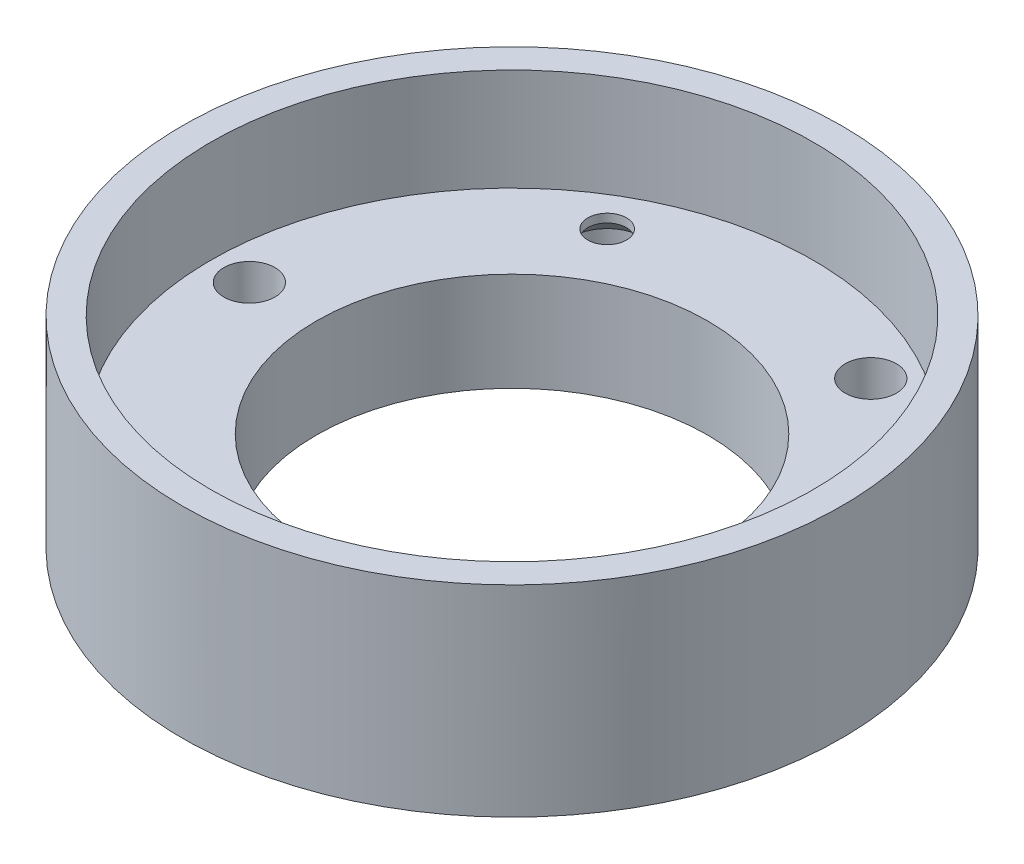
ISO-10303-21;
HEADER;
FILE_DESCRIPTION(('STEP AP214'),'2;1');
FILE_NAME('part.step','',(''),(''),'','','');
FILE_SCHEMA(('AUTOMOTIVE_DESIGN { 1 0 10303 214 1 1 1 1 }'));
ENDSEC;
DATA;
#1=APPLICATION_CONTEXT('core data for automotive mechanical design processes');
#2=APPLICATION_PROTOCOL_DEFINITION('international standard','automotive_design',2000,#1);
#3=PRODUCT_CONTEXT('',#1,'mechanical');
#4=PRODUCT('Part','Part','',(#3));
#5=PRODUCT_RELATED_PRODUCT_CATEGORY('part','',(#4));
#6=PRODUCT_DEFINITION_FORMATION('','',#4);
#7=PRODUCT_DEFINITION_CONTEXT('part definition',#1,'design');
#8=PRODUCT_DEFINITION('design','',#6,#7);
#9=PRODUCT_DEFINITION_SHAPE('','',#8);
#10=(LENGTH_UNIT() NAMED_UNIT(*) SI_UNIT(.MILLI.,.METRE.));
#11=(NAMED_UNIT(*) PLANE_ANGLE_UNIT() SI_UNIT($,.RADIAN.));
#12=(NAMED_UNIT(*) SI_UNIT($,.STERADIAN.) SOLID_ANGLE_UNIT());
#13=UNCERTAINTY_MEASURE_WITH_UNIT(LENGTH_MEASURE(1.E-05),#10,'distance_accuracy_value','');
#14=(GEOMETRIC_REPRESENTATION_CONTEXT(3) GLOBAL_UNCERTAINTY_ASSIGNED_CONTEXT((#13)) GLOBAL_UNIT_ASSIGNED_CONTEXT((#10,
#11,#12)) REPRESENTATION_CONTEXT('',''));
#15=CARTESIAN_POINT('',(0.,0.,0.));
#16=DIRECTION('',(0.,0.,1.));
#17=DIRECTION('',(1.,0.,0.));
#18=AXIS2_PLACEMENT_3D('',#15,#16,#17);
#19=CARTESIAN_POINT('',(0.,11.2,0.));
#20=DIRECTION('',(0.,-1.,0.));
#21=DIRECTION('',(0.,0.,-1.));
#22=AXIS2_PLACEMENT_3D('',#19,#20,#21);
#23=CYLINDRICAL_SURFACE('',#22,29.);
#24=CARTESIAN_POINT('',(0.,11.2,0.));
#25=DIRECTION('',(0.,1.,0.));
#26=DIRECTION('',(0.,0.,1.));
#27=AXIS2_PLACEMENT_3D('',#24,#25,#26);
#28=CIRCLE('',#27,29.);
#29=CARTESIAN_POINT('',(0.,11.2,29.));
#30=VERTEX_POINT('',#29);
#31=EDGE_CURVE('E10',#30,#30,#28,.T.);
#32=ORIENTED_EDGE('',*,*,#31,.F.);
#33=EDGE_LOOP('',(#32));
#34=FACE_BOUND('',#33,.T.);
#35=CARTESIAN_POINT('',(0.,-6.5,0.));
#36=DIRECTION('',(0.,-1.,0.));
#37=DIRECTION('',(0.,0.,-1.));
#38=AXIS2_PLACEMENT_3D('',#35,#36,#37);
#39=CIRCLE('',#38,29.);
#40=CARTESIAN_POINT('',(0.,-6.5,-29.));
#41=VERTEX_POINT('',#40);
#42=EDGE_CURVE('E186',#41,#41,#39,.T.);
#43=ORIENTED_EDGE('',*,*,#42,.F.);
#44=EDGE_LOOP('',(#43));
#45=FACE_BOUND('',#44,.T.);
#46=ADVANCED_FACE('F31',(#34,#45),#23,.T.);
#47=CARTESIAN_POINT('',(0.,11.2,0.));
#48=DIRECTION('',(0.,1.,0.));
#49=DIRECTION('',(0.,0.,1.));
#50=AXIS2_PLACEMENT_3D('',#47,#48,#49);
#51=PLANE('',#50);
#52=CARTESIAN_POINT('',(0.,11.2,0.));
#53=DIRECTION('',(0.,1.,0.));
#54=DIRECTION('',(0.,0.,1.));
#55=AXIS2_PLACEMENT_3D('',#52,#53,#54);
#56=CIRCLE('',#55,26.5);
#57=CARTESIAN_POINT('',(0.,11.2,26.5));
#58=VERTEX_POINT('',#57);
#59=EDGE_CURVE('E43',#58,#58,#56,.T.);
#60=ORIENTED_EDGE('',*,*,#59,.F.);
#61=EDGE_LOOP('',(#60));
#62=FACE_BOUND('',#61,.T.);
#63=ORIENTED_EDGE('',*,*,#31,.T.);
#64=EDGE_LOOP('',(#63));
#65=FACE_BOUND('',#64,.T.);
#66=ADVANCED_FACE('F75',(#62,#65),#51,.T.);
#67=CARTESIAN_POINT('',(0.,2.2,0.));
#68=DIRECTION('',(0.,1.,0.));
#69=DIRECTION('',(0.,0.,1.));
#70=AXIS2_PLACEMENT_3D('',#67,#68,#69);
#71=CYLINDRICAL_SURFACE('',#70,26.5);
#72=CARTESIAN_POINT('',(0.,2.2,0.));
#73=DIRECTION('',(0.,1.,0.));
#74=DIRECTION('',(0.,0.,1.));
#75=AXIS2_PLACEMENT_3D('',#72,#73,#74);
#76=CIRCLE('',#75,26.5);
#77=CARTESIAN_POINT('',(0.,2.2,26.5));
#78=VERTEX_POINT('',#77);
#79=EDGE_CURVE('E38',#78,#78,#76,.T.);
#80=ORIENTED_EDGE('',*,*,#79,.F.);
#81=EDGE_LOOP('',(#80));
#82=FACE_BOUND('',#81,.T.);
#83=ORIENTED_EDGE('',*,*,#59,.T.);
#84=EDGE_LOOP('',(#83));
#85=FACE_BOUND('',#84,.T.);
#86=ADVANCED_FACE('F73',(#82,#85),#71,.F.);
#87=CARTESIAN_POINT('',(0.,2.2,0.));
#88=DIRECTION('',(0.,1.,0.));
#89=DIRECTION('',(0.,0.,1.));
#90=AXIS2_PLACEMENT_3D('',#87,#88,#89);
#91=PLANE('',#90);
#92=CARTESIAN_POINT('',(-23.1125,2.2,0.));
#93=DIRECTION('',(0.,1.,0.));
#94=DIRECTION('',(0.,0.,1.));
#95=AXIS2_PLACEMENT_3D('',#92,#93,#94);
#96=CIRCLE('',#95,2.24999999999999);
#97=CARTESIAN_POINT('',(-23.1125,2.2,2.24999999999999));
#98=VERTEX_POINT('',#97);
#99=EDGE_CURVE('E147',#98,#98,#96,.T.);
#100=ORIENTED_EDGE('',*,*,#99,.F.);
#101=EDGE_LOOP('',(#100));
#102=FACE_BOUND('',#101,.T.);
#103=CARTESIAN_POINT('',(11.55625,2.2,20.0160121449678));
#104=DIRECTION('',(0.,1.,0.));
#105=DIRECTION('',(0.,0.,1.));
#106=AXIS2_PLACEMENT_3D('',#103,#104,#105);
#107=CIRCLE('',#106,2.24999999999999);
#108=CARTESIAN_POINT('',(11.55625,2.2,22.2660121449678));
#109=VERTEX_POINT('',#108);
#110=EDGE_CURVE('E157',#109,#109,#107,.T.);
#111=ORIENTED_EDGE('',*,*,#110,.F.);
#112=EDGE_LOOP('',(#111));
#113=FACE_BOUND('',#112,.T.);
#114=CARTESIAN_POINT('',(11.55625,2.2,-20.0160121449678));
#115=DIRECTION('',(0.,1.,0.));
#116=DIRECTION('',(0.,0.,1.));
#117=AXIS2_PLACEMENT_3D('',#114,#115,#116);
#118=CIRCLE('',#117,2.24999999999999);
#119=CARTESIAN_POINT('',(11.55625,2.2,-17.7660121449678));
#120=VERTEX_POINT('',#119);
#121=EDGE_CURVE('E163',#120,#120,#118,.T.);
#122=ORIENTED_EDGE('',*,*,#121,.F.);
#123=EDGE_LOOP('',(#122));
#124=FACE_BOUND('',#123,.T.);
#125=CARTESIAN_POINT('',(22.875,2.2,0.));
#126=DIRECTION('',(0.,1.,0.));
#127=DIRECTION('',(0.,0.,1.));
#128=AXIS2_PLACEMENT_3D('',#125,#126,#127);
#129=CIRCLE('',#128,1.7);
#130=CARTESIAN_POINT('',(22.875,2.2,1.7));
#131=VERTEX_POINT('',#130);
#132=EDGE_CURVE('E34',#131,#131,#129,.T.);
#133=ORIENTED_EDGE('',*,*,#132,.F.);
#134=EDGE_LOOP('',(#133));
#135=FACE_BOUND('',#134,.T.);
#136=CARTESIAN_POINT('',(-11.4375000000001,2.2,-19.810331111569));
#137=DIRECTION('',(0.,1.,0.));
#138=DIRECTION('',(0.,0.,1.));
#139=AXIS2_PLACEMENT_3D('',#136,#137,#138);
#140=CIRCLE('',#139,1.7);
#141=CARTESIAN_POINT('',(-11.4375000000001,2.2,-18.110331111569));
#142=VERTEX_POINT('',#141);
#143=EDGE_CURVE('E51',#142,#142,#140,.T.);
#144=ORIENTED_EDGE('',*,*,#143,.F.);
#145=EDGE_LOOP('',(#144));
#146=FACE_BOUND('',#145,.T.);
#147=CARTESIAN_POINT('',(-11.4374999999998,2.2,19.8103311115691));
#148=DIRECTION('',(0.,1.,0.));
#149=DIRECTION('',(0.,0.,1.));
#150=AXIS2_PLACEMENT_3D('',#147,#148,#149);
#151=CIRCLE('',#150,1.7);
#152=CARTESIAN_POINT('',(-11.4374999999998,2.2,21.5103311115691));
#153=VERTEX_POINT('',#152);
#154=EDGE_CURVE('E47',#153,#153,#151,.T.);
#155=ORIENTED_EDGE('',*,*,#154,.F.);
#156=EDGE_LOOP('',(#155));
#157=FACE_BOUND('',#156,.T.);
#158=CARTESIAN_POINT('',(0.,2.2,0.));
#159=DIRECTION('',(0.,1.,0.));
#160=DIRECTION('',(0.,0.,1.));
#161=AXIS2_PLACEMENT_3D('',#158,#159,#160);
#162=CIRCLE('',#161,17.225);
#163=CARTESIAN_POINT('',(0.,2.2,17.225));
#164=VERTEX_POINT('',#163);
#165=EDGE_CURVE('E49',#164,#164,#162,.T.);
#166=ORIENTED_EDGE('',*,*,#165,.F.);
#167=EDGE_LOOP('',(#166));
#168=FACE_BOUND('',#167,.T.);
#169=ORIENTED_EDGE('',*,*,#79,.T.);
#170=EDGE_LOOP('',(#169));
#171=FACE_BOUND('',#170,.T.);
#172=ADVANCED_FACE('F80',(#102,#113,#124,#135,#146,#157,#168,#171),#91,.T.);
#173=CARTESIAN_POINT('',(0.,0.,0.));
#174=DIRECTION('',(0.,1.,0.));
#175=DIRECTION('',(0.,0.,1.));
#176=AXIS2_PLACEMENT_3D('',#173,#174,#175);
#177=CYLINDRICAL_SURFACE('',#176,17.225);
#178=ORIENTED_EDGE('',*,*,#165,.T.);
#179=EDGE_LOOP('',(#178));
#180=FACE_BOUND('',#179,.T.);
#181=CARTESIAN_POINT('',(0.,-6.5,0.));
#182=DIRECTION('',(0.,-1.,0.));
#183=DIRECTION('',(0.,0.,-1.));
#184=AXIS2_PLACEMENT_3D('',#181,#182,#183);
#185=CIRCLE('',#184,17.225);
#186=CARTESIAN_POINT('',(0.,-6.5,-17.225));
#187=VERTEX_POINT('',#186);
#188=EDGE_CURVE('E182',#187,#187,#185,.T.);
#189=ORIENTED_EDGE('',*,*,#188,.T.);
#190=EDGE_LOOP('',(#189));
#191=FACE_BOUND('',#190,.T.);
#192=ADVANCED_FACE('F88',(#180,#191),#177,.F.);
#193=CARTESIAN_POINT('',(-11.4374999999998,0.,19.8103311115691));
#194=DIRECTION('',(0.,-1.,0.));
#195=DIRECTION('',(0.,0.,-1.));
#196=AXIS2_PLACEMENT_3D('',#193,#194,#195);
#197=CYLINDRICAL_SURFACE('',#196,1.7);
#198=ORIENTED_EDGE('',*,*,#154,.T.);
#199=EDGE_LOOP('',(#198));
#200=FACE_BOUND('',#199,.T.);
#201=CARTESIAN_POINT('',(-11.4374999999998,1.45,19.8103311115691));
#202=DIRECTION('',(0.,-1.,0.));
#203=DIRECTION('',(0.,0.,-1.));
#204=AXIS2_PLACEMENT_3D('',#201,#202,#203);
#205=CIRCLE('',#204,1.7);
#206=CARTESIAN_POINT('',(-11.4374999999998,1.45,18.1103311115691));
#207=VERTEX_POINT('',#206);
#208=EDGE_CURVE('E50',#207,#207,#205,.T.);
#209=ORIENTED_EDGE('',*,*,#208,.T.);
#210=EDGE_LOOP('',(#209));
#211=FACE_BOUND('',#210,.T.);
#212=ADVANCED_FACE('F92',(#200,#211),#197,.F.);
#213=CARTESIAN_POINT('',(-11.4374999999998,0.,19.8103311115691));
#214=DIRECTION('',(0.,-1.,0.));
#215=DIRECTION('',(0.,0.,-1.));
#216=AXIS2_PLACEMENT_3D('',#213,#214,#215);
#217=CONICAL_SURFACE('',#216,3.15,0.785398163397449);
#218=ORIENTED_EDGE('',*,*,#208,.F.);
#219=EDGE_LOOP('',(#218));
#220=FACE_BOUND('',#219,.T.);
#221=CARTESIAN_POINT('',(-11.4374999999998,0.,19.8103311115691));
#222=DIRECTION('',(0.,-1.,0.));
#223=DIRECTION('',(0.,0.,-1.));
#224=AXIS2_PLACEMENT_3D('',#221,#222,#223);
#225=CIRCLE('',#224,3.15);
#226=CARTESIAN_POINT('',(-11.4374999999998,0.,22.9603311115691));
#227=VERTEX_POINT('',#226);
#228=EDGE_CURVE('E176',#227,#227,#225,.T.);
#229=ORIENTED_EDGE('',*,*,#228,.T.);
#230=EDGE_LOOP('',(#229));
#231=FACE_BOUND('',#230,.T.);
#232=ADVANCED_FACE('F95',(#220,#231),#217,.F.);
#233=CARTESIAN_POINT('',(-11.4375000000001,0.,-19.810331111569));
#234=DIRECTION('',(0.,-1.,0.));
#235=DIRECTION('',(0.,0.,-1.));
#236=AXIS2_PLACEMENT_3D('',#233,#234,#235);
#237=CYLINDRICAL_SURFACE('',#236,1.7);
#238=ORIENTED_EDGE('',*,*,#143,.T.);
#239=EDGE_LOOP('',(#238));
#240=FACE_BOUND('',#239,.T.);
#241=CARTESIAN_POINT('',(-11.4375000000001,1.45,-19.810331111569));
#242=DIRECTION('',(0.,-1.,0.));
#243=DIRECTION('',(0.,0.,-1.));
#244=AXIS2_PLACEMENT_3D('',#241,#242,#243);
#245=CIRCLE('',#244,1.7);
#246=CARTESIAN_POINT('',(-11.4375000000001,1.45,-21.510331111569));
#247=VERTEX_POINT('',#246);
#248=EDGE_CURVE('E53',#247,#247,#245,.T.);
#249=ORIENTED_EDGE('',*,*,#248,.T.);
#250=EDGE_LOOP('',(#249));
#251=FACE_BOUND('',#250,.T.);
#252=ADVANCED_FACE('F99',(#240,#251),#237,.F.);
#253=CARTESIAN_POINT('',(-11.4375000000001,0.,-19.810331111569));
#254=DIRECTION('',(0.,-1.,0.));
#255=DIRECTION('',(0.,0.,-1.));
#256=AXIS2_PLACEMENT_3D('',#253,#254,#255);
#257=CONICAL_SURFACE('',#256,3.15,0.785398163397449);
#258=ORIENTED_EDGE('',*,*,#248,.F.);
#259=EDGE_LOOP('',(#258));
#260=FACE_BOUND('',#259,.T.);
#261=CARTESIAN_POINT('',(-11.4375000000001,0.,-19.810331111569));
#262=DIRECTION('',(0.,-1.,0.));
#263=DIRECTION('',(0.,0.,-1.));
#264=AXIS2_PLACEMENT_3D('',#261,#262,#263);
#265=CIRCLE('',#264,3.15);
#266=CARTESIAN_POINT('',(-11.4375000000001,0.,-16.660331111569));
#267=VERTEX_POINT('',#266);
#268=EDGE_CURVE('E170',#267,#267,#265,.T.);
#269=ORIENTED_EDGE('',*,*,#268,.T.);
#270=EDGE_LOOP('',(#269));
#271=FACE_BOUND('',#270,.T.);
#272=ADVANCED_FACE('F103',(#260,#271),#257,.F.);
#273=CARTESIAN_POINT('',(22.875,0.,0.));
#274=DIRECTION('',(0.,-1.,0.));
#275=DIRECTION('',(0.,0.,-1.));
#276=AXIS2_PLACEMENT_3D('',#273,#274,#275);
#277=CYLINDRICAL_SURFACE('',#276,1.7);
#278=ORIENTED_EDGE('',*,*,#132,.T.);
#279=EDGE_LOOP('',(#278));
#280=FACE_BOUND('',#279,.T.);
#281=CARTESIAN_POINT('',(22.875,1.45,0.));
#282=DIRECTION('',(0.,-1.,0.));
#283=DIRECTION('',(0.,0.,-1.));
#284=AXIS2_PLACEMENT_3D('',#281,#282,#283);
#285=CIRCLE('',#284,1.7);
#286=CARTESIAN_POINT('',(22.875,1.45,-1.7));
#287=VERTEX_POINT('',#286);
#288=EDGE_CURVE('E63',#287,#287,#285,.T.);
#289=ORIENTED_EDGE('',*,*,#288,.T.);
#290=EDGE_LOOP('',(#289));
#291=FACE_BOUND('',#290,.T.);
#292=ADVANCED_FACE('F106',(#280,#291),#277,.F.);
#293=CARTESIAN_POINT('',(22.875,0.,0.));
#294=DIRECTION('',(0.,-1.,0.));
#295=DIRECTION('',(0.,0.,-1.));
#296=AXIS2_PLACEMENT_3D('',#293,#294,#295);
#297=CONICAL_SURFACE('',#296,3.15,0.785398163397448);
#298=ORIENTED_EDGE('',*,*,#288,.F.);
#299=EDGE_LOOP('',(#298));
#300=FACE_BOUND('',#299,.T.);
#301=CARTESIAN_POINT('',(22.875,0.,0.));
#302=DIRECTION('',(0.,-1.,0.));
#303=DIRECTION('',(0.,0.,-1.));
#304=AXIS2_PLACEMENT_3D('',#301,#302,#303);
#305=CIRCLE('',#304,3.15);
#306=CARTESIAN_POINT('',(22.875,0.,3.15));
#307=VERTEX_POINT('',#306);
#308=EDGE_CURVE('E166',#307,#307,#305,.T.);
#309=ORIENTED_EDGE('',*,*,#308,.T.);
#310=EDGE_LOOP('',(#309));
#311=FACE_BOUND('',#310,.T.);
#312=ADVANCED_FACE('F110',(#300,#311),#297,.F.);
#313=CARTESIAN_POINT('',(0.,-6.5,0.));
#314=DIRECTION('',(0.,-1.,0.));
#315=DIRECTION('',(0.,0.,-1.));
#316=AXIS2_PLACEMENT_3D('',#313,#314,#315);
#317=PLANE('',#316);
#318=CARTESIAN_POINT('',(-23.1125,-6.5,0.));
#319=DIRECTION('',(0.,-1.,0.));
#320=DIRECTION('',(0.,0.,-1.));
#321=AXIS2_PLACEMENT_3D('',#318,#319,#320);
#322=CIRCLE('',#321,2.24999999999999);
#323=CARTESIAN_POINT('',(-23.1125,-6.5,-2.24999999999999));
#324=VERTEX_POINT('',#323);
#325=EDGE_CURVE('E150',#324,#324,#322,.T.);
#326=ORIENTED_EDGE('',*,*,#325,.F.);
#327=EDGE_LOOP('',(#326));
#328=FACE_BOUND('',#327,.T.);
#329=CARTESIAN_POINT('',(11.55625,-6.5,20.0160121449678));
#330=DIRECTION('',(0.,-1.,0.));
#331=DIRECTION('',(0.,0.,-1.));
#332=AXIS2_PLACEMENT_3D('',#329,#330,#331);
#333=CIRCLE('',#332,2.24999999999999);
#334=CARTESIAN_POINT('',(11.55625,-6.5,17.7660121449679));
#335=VERTEX_POINT('',#334);
#336=EDGE_CURVE('E152',#335,#335,#333,.T.);
#337=ORIENTED_EDGE('',*,*,#336,.F.);
#338=EDGE_LOOP('',(#337));
#339=FACE_BOUND('',#338,.T.);
#340=CARTESIAN_POINT('',(11.55625,-6.5,-20.0160121449678));
#341=DIRECTION('',(0.,-1.,0.));
#342=DIRECTION('',(0.,0.,-1.));
#343=AXIS2_PLACEMENT_3D('',#340,#341,#342);
#344=CIRCLE('',#343,2.24999999999999);
#345=CARTESIAN_POINT('',(11.55625,-6.5,-22.2660121449678));
#346=VERTEX_POINT('',#345);
#347=EDGE_CURVE('E160',#346,#346,#344,.T.);
#348=ORIENTED_EDGE('',*,*,#347,.F.);
#349=EDGE_LOOP('',(#348));
#350=FACE_BOUND('',#349,.T.);
#351=CARTESIAN_POINT('',(-11.4375000000001,-6.5,-19.810331111569));
#352=DIRECTION('',(0.,-1.,0.));
#353=DIRECTION('',(0.,0.,-1.));
#354=AXIS2_PLACEMENT_3D('',#351,#352,#353);
#355=CIRCLE('',#354,3.15);
#356=CARTESIAN_POINT('',(-11.4375000000001,-6.5,-16.660331111569));
#357=VERTEX_POINT('',#356);
#358=EDGE_CURVE('E173',#357,#357,#355,.T.);
#359=ORIENTED_EDGE('',*,*,#358,.F.);
#360=EDGE_LOOP('',(#359));
#361=FACE_BOUND('',#360,.T.);
#362=ORIENTED_EDGE('',*,*,#188,.F.);
#363=EDGE_LOOP('',(#362));
#364=FACE_BOUND('',#363,.T.);
#365=ORIENTED_EDGE('',*,*,#42,.T.);
#366=EDGE_LOOP('',(#365));
#367=FACE_BOUND('',#366,.T.);
#368=CARTESIAN_POINT('',(-11.4374999999998,-6.5,19.8103311115691));
#369=DIRECTION('',(0.,-1.,0.));
#370=DIRECTION('',(0.,0.,-1.));
#371=AXIS2_PLACEMENT_3D('',#368,#369,#370);
#372=CIRCLE('',#371,3.15);
#373=CARTESIAN_POINT('',(-11.4374999999998,-6.5,22.9603311115691));
#374=VERTEX_POINT('',#373);
#375=EDGE_CURVE('E179',#374,#374,#372,.T.);
#376=ORIENTED_EDGE('',*,*,#375,.F.);
#377=EDGE_LOOP('',(#376));
#378=FACE_BOUND('',#377,.T.);
#379=CARTESIAN_POINT('',(22.875,-6.5,0.));
#380=DIRECTION('',(0.,-1.,0.));
#381=DIRECTION('',(0.,0.,-1.));
#382=AXIS2_PLACEMENT_3D('',#379,#380,#381);
#383=CIRCLE('',#382,3.15);
#384=CARTESIAN_POINT('',(22.875,-6.5,3.15));
#385=VERTEX_POINT('',#384);
#386=EDGE_CURVE('E167',#385,#385,#383,.T.);
#387=ORIENTED_EDGE('',*,*,#386,.F.);
#388=EDGE_LOOP('',(#387));
#389=FACE_BOUND('',#388,.T.);
#390=ADVANCED_FACE('F114',(#328,#339,#350,#361,#364,#367,#378,#389),#317,.T.);
#391=CARTESIAN_POINT('',(-11.4374999999998,-6.5,19.8103311115691));
#392=DIRECTION('',(0.,1.,0.));
#393=DIRECTION('',(0.,0.,1.));
#394=AXIS2_PLACEMENT_3D('',#391,#392,#393);
#395=CYLINDRICAL_SURFACE('',#394,3.15);
#396=CARTESIAN_POINT('',(-11.4374999999998,-6.5,22.9603311115691));
#397=CARTESIAN_POINT('',(-11.4374999999998,-6.43229166666667,22.9603311115691));
#398=CARTESIAN_POINT('',(-11.4374999999998,-6.36458333333333,22.9603311115691));
#399=CARTESIAN_POINT('',(-11.4374999999998,-6.22916666666667,22.9603311115691));
#400=CARTESIAN_POINT('',(-11.4374999999998,-6.16145833333333,22.9603311115691));
#401=CARTESIAN_POINT('',(-11.4374999999998,-6.02604166666667,22.9603311115691));
#402=CARTESIAN_POINT('',(-11.4374999999998,-5.95833333333333,22.9603311115691));
#403=CARTESIAN_POINT('',(-11.4374999999998,-5.82291666666667,22.9603311115691));
#404=CARTESIAN_POINT('',(-11.4374999999998,-5.75520833333333,22.9603311115691));
#405=CARTESIAN_POINT('',(-11.4374999999998,-5.61979166666667,22.9603311115691));
#406=CARTESIAN_POINT('',(-11.4374999999998,-5.55208333333333,22.9603311115691));
#407=CARTESIAN_POINT('',(-11.4374999999998,-5.41666666666667,22.9603311115691));
#408=CARTESIAN_POINT('',(-11.4374999999998,-5.34895833333333,22.9603311115691));
#409=CARTESIAN_POINT('',(-11.4374999999998,-5.21354166666667,22.9603311115691));
#410=CARTESIAN_POINT('',(-11.4374999999998,-5.14583333333333,22.9603311115691));
#411=CARTESIAN_POINT('',(-11.4374999999998,-5.01041666666667,22.9603311115691));
#412=CARTESIAN_POINT('',(-11.4374999999998,-4.94270833333333,22.9603311115691));
#413=CARTESIAN_POINT('',(-11.4374999999998,-4.80729166666667,22.9603311115691));
#414=CARTESIAN_POINT('',(-11.4374999999998,-4.73958333333333,22.9603311115691));
#415=CARTESIAN_POINT('',(-11.4374999999998,-4.60416666666667,22.9603311115691));
#416=CARTESIAN_POINT('',(-11.4374999999998,-4.53645833333333,22.9603311115691));
#417=CARTESIAN_POINT('',(-11.4374999999998,-4.40104166666667,22.9603311115691));
#418=CARTESIAN_POINT('',(-11.4374999999998,-4.33333333333333,22.9603311115691));
#419=CARTESIAN_POINT('',(-11.4374999999998,-4.19791666666667,22.9603311115691));
#420=CARTESIAN_POINT('',(-11.4374999999998,-4.13020833333333,22.9603311115691));
#421=CARTESIAN_POINT('',(-11.4374999999998,-3.99479166666667,22.9603311115691));
#422=CARTESIAN_POINT('',(-11.4374999999998,-3.92708333333333,22.9603311115691));
#423=CARTESIAN_POINT('',(-11.4374999999998,-3.79166666666667,22.9603311115691));
#424=CARTESIAN_POINT('',(-11.4374999999998,-3.72395833333333,22.9603311115691));
#425=CARTESIAN_POINT('',(-11.4374999999998,-3.58854166666667,22.9603311115691));
#426=CARTESIAN_POINT('',(-11.4374999999998,-3.52083333333333,22.9603311115691));
#427=CARTESIAN_POINT('',(-11.4374999999998,-3.38541666666667,22.9603311115691));
#428=CARTESIAN_POINT('',(-11.4374999999998,-3.31770833333333,22.9603311115691));
#429=CARTESIAN_POINT('',(-11.4374999999998,-3.18229166666667,22.9603311115691));
#430=CARTESIAN_POINT('',(-11.4374999999998,-3.11458333333333,22.9603311115691));
#431=CARTESIAN_POINT('',(-11.4374999999998,-2.97916666666667,22.9603311115691));
#432=CARTESIAN_POINT('',(-11.4374999999998,-2.91145833333333,22.9603311115691));
#433=CARTESIAN_POINT('',(-11.4374999999998,-2.77604166666667,22.9603311115691));
#434=CARTESIAN_POINT('',(-11.4374999999998,-2.70833333333333,22.9603311115691));
#435=CARTESIAN_POINT('',(-11.4374999999998,-2.57291666666667,22.9603311115691));
#436=CARTESIAN_POINT('',(-11.4374999999998,-2.50520833333333,22.9603311115691));
#437=CARTESIAN_POINT('',(-11.4374999999998,-2.36979166666667,22.9603311115691));
#438=CARTESIAN_POINT('',(-11.4374999999998,-2.30208333333333,22.9603311115691));
#439=CARTESIAN_POINT('',(-11.4374999999998,-2.16666666666667,22.9603311115691));
#440=CARTESIAN_POINT('',(-11.4374999999998,-2.09895833333333,22.9603311115691));
#441=CARTESIAN_POINT('',(-11.4374999999998,-1.96354166666667,22.9603311115691));
#442=CARTESIAN_POINT('',(-11.4374999999998,-1.89583333333333,22.9603311115691));
#443=CARTESIAN_POINT('',(-11.4374999999998,-1.76041666666667,22.9603311115691));
#444=CARTESIAN_POINT('',(-11.4374999999998,-1.69270833333333,22.9603311115691));
#445=CARTESIAN_POINT('',(-11.4374999999998,-1.55729166666667,22.9603311115691));
#446=CARTESIAN_POINT('',(-11.4374999999998,-1.48958333333333,22.9603311115691));
#447=CARTESIAN_POINT('',(-11.4374999999998,-1.35416666666667,22.9603311115691));
#448=CARTESIAN_POINT('',(-11.4374999999998,-1.28645833333333,22.9603311115691));
#449=CARTESIAN_POINT('',(-11.4374999999998,-1.15104166666667,22.9603311115691));
#450=CARTESIAN_POINT('',(-11.4374999999998,-1.08333333333333,22.9603311115691));
#451=CARTESIAN_POINT('',(-11.4374999999998,-0.947916666666667,22.9603311115691));
#452=CARTESIAN_POINT('',(-11.4374999999998,-0.880208333333333,22.9603311115691));
#453=CARTESIAN_POINT('',(-11.4374999999998,-0.744791666666667,22.9603311115691));
#454=CARTESIAN_POINT('',(-11.4374999999998,-0.677083333333333,22.9603311115691));
#455=CARTESIAN_POINT('',(-11.4374999999998,-0.541666666666667,22.9603311115691));
#456=CARTESIAN_POINT('',(-11.4374999999998,-0.473958333333333,22.9603311115691));
#457=CARTESIAN_POINT('',(-11.4374999999998,-0.338541666666667,22.9603311115691));
#458=CARTESIAN_POINT('',(-11.4374999999998,-0.270833333333334,22.9603311115691));
#459=CARTESIAN_POINT('',(-11.4374999999998,-0.135416666666667,22.9603311115691));
#460=CARTESIAN_POINT('',(-11.4374999999998,-0.0677083333333334,22.9603311115691));
#461=CARTESIAN_POINT('',(-11.4374999999998,0.,22.9603311115691));
#462=B_SPLINE_CURVE_WITH_KNOTS('',3,(#396,#397,#398,#399,#400,#401,#402,#403,#404,#405,#406,
#407,#408,#409,#410,#411,#412,#413,#414,#415,#416,#417,#418,#419,#420,#421,#422,#423,#424,#425,
#426,#427,#428,#429,#430,#431,#432,#433,#434,#435,#436,#437,#438,#439,#440,#441,#442,#443,#444,
#445,#446,#447,#448,#449,#450,#451,#452,#453,#454,#455,#456,#457,#458,#459,#460,#461),
.UNSPECIFIED.,.F.,.F.,(4,2,2,2,2,2,2,2,2,2,2,2,2,2,2,2,2,2,2,2,2,2,2,2,2,2,2,2,2,2,2,2,4),(0.,
0.203125,0.40625,0.609375000000001,0.812500000000001,1.015625,1.21875,1.421875,1.625,1.828125,
2.03125,2.234375,2.4375,2.640625,2.84375,3.046875,3.25,3.453125,3.65625,3.859375,4.0625,
4.265625,4.46875,4.671875,4.875,5.078125,5.28125,5.484375,5.6875,5.890625,6.09375,6.296875,6.5),.UNSPECIFIED.);
#463=EDGE_CURVE('BSEAM118',#374,#227,#462,.T.);
#464=ORIENTED_EDGE('',*,*,#375,.T.);
#465=ORIENTED_EDGE('',*,*,#228,.F.);
#466=ORIENTED_EDGE('',*,*,#463,.T.);
#467=ORIENTED_EDGE('',*,*,#463,.F.);
#468=EDGE_LOOP('',(#464,#466,#465,#467));
#469=FACE_BOUND('',#468,.T.);
#470=ADVANCED_FACE('F118',(#469),#395,.F.);
#471=CARTESIAN_POINT('',(-11.4375000000001,-6.5,-19.810331111569));
#472=DIRECTION('',(0.,1.,0.));
#473=DIRECTION('',(0.,0.,1.));
#474=AXIS2_PLACEMENT_3D('',#471,#472,#473);
#475=CYLINDRICAL_SURFACE('',#474,3.15);
#476=CARTESIAN_POINT('',(-11.4375000000001,-6.5,-16.660331111569));
#477=CARTESIAN_POINT('',(-11.4375000000001,-6.43229166666667,-16.660331111569));
#478=CARTESIAN_POINT('',(-11.4375000000001,-6.36458333333333,-16.660331111569));
#479=CARTESIAN_POINT('',(-11.4375000000001,-6.22916666666667,-16.660331111569));
#480=CARTESIAN_POINT('',(-11.4375000000001,-6.16145833333333,-16.660331111569));
#481=CARTESIAN_POINT('',(-11.4375000000001,-6.02604166666667,-16.660331111569));
#482=CARTESIAN_POINT('',(-11.4375000000001,-5.95833333333333,-16.660331111569));
#483=CARTESIAN_POINT('',(-11.4375000000001,-5.82291666666667,-16.660331111569));
#484=CARTESIAN_POINT('',(-11.4375000000001,-5.75520833333333,-16.660331111569));
#485=CARTESIAN_POINT('',(-11.4375000000001,-5.61979166666667,-16.660331111569));
#486=CARTESIAN_POINT('',(-11.4375000000001,-5.55208333333333,-16.660331111569));
#487=CARTESIAN_POINT('',(-11.4375000000001,-5.41666666666667,-16.660331111569));
#488=CARTESIAN_POINT('',(-11.4375000000001,-5.34895833333333,-16.660331111569));
#489=CARTESIAN_POINT('',(-11.4375000000001,-5.21354166666667,-16.660331111569));
#490=CARTESIAN_POINT('',(-11.4375000000001,-5.14583333333333,-16.660331111569));
#491=CARTESIAN_POINT('',(-11.4375000000001,-5.01041666666667,-16.660331111569));
#492=CARTESIAN_POINT('',(-11.4375000000001,-4.94270833333333,-16.660331111569));
#493=CARTESIAN_POINT('',(-11.4375000000001,-4.80729166666667,-16.660331111569));
#494=CARTESIAN_POINT('',(-11.4375000000001,-4.73958333333333,-16.660331111569));
#495=CARTESIAN_POINT('',(-11.4375000000001,-4.60416666666667,-16.660331111569));
#496=CARTESIAN_POINT('',(-11.4375000000001,-4.53645833333333,-16.660331111569));
#497=CARTESIAN_POINT('',(-11.4375000000001,-4.40104166666667,-16.660331111569));
#498=CARTESIAN_POINT('',(-11.4375000000001,-4.33333333333333,-16.660331111569));
#499=CARTESIAN_POINT('',(-11.4375000000001,-4.19791666666667,-16.660331111569));
#500=CARTESIAN_POINT('',(-11.4375000000001,-4.13020833333333,-16.660331111569));
#501=CARTESIAN_POINT('',(-11.4375000000001,-3.99479166666667,-16.660331111569));
#502=CARTESIAN_POINT('',(-11.4375000000001,-3.92708333333333,-16.660331111569));
#503=CARTESIAN_POINT('',(-11.4375000000001,-3.79166666666667,-16.660331111569));
#504=CARTESIAN_POINT('',(-11.4375000000001,-3.72395833333333,-16.660331111569));
#505=CARTESIAN_POINT('',(-11.4375000000001,-3.58854166666667,-16.660331111569));
#506=CARTESIAN_POINT('',(-11.4375000000001,-3.52083333333333,-16.660331111569));
#507=CARTESIAN_POINT('',(-11.4375000000001,-3.38541666666667,-16.660331111569));
#508=CARTESIAN_POINT('',(-11.4375000000001,-3.31770833333333,-16.660331111569));
#509=CARTESIAN_POINT('',(-11.4375000000001,-3.18229166666667,-16.660331111569));
#510=CARTESIAN_POINT('',(-11.4375000000001,-3.11458333333333,-16.660331111569));
#511=CARTESIAN_POINT('',(-11.4375000000001,-2.97916666666667,-16.660331111569));
#512=CARTESIAN_POINT('',(-11.4375000000001,-2.91145833333333,-16.660331111569));
#513=CARTESIAN_POINT('',(-11.4375000000001,-2.77604166666667,-16.660331111569));
#514=CARTESIAN_POINT('',(-11.4375000000001,-2.70833333333333,-16.660331111569));
#515=CARTESIAN_POINT('',(-11.4375000000001,-2.57291666666667,-16.660331111569));
#516=CARTESIAN_POINT('',(-11.4375000000001,-2.50520833333333,-16.660331111569));
#517=CARTESIAN_POINT('',(-11.4375000000001,-2.36979166666667,-16.660331111569));
#518=CARTESIAN_POINT('',(-11.4375000000001,-2.30208333333333,-16.660331111569));
#519=CARTESIAN_POINT('',(-11.4375000000001,-2.16666666666667,-16.660331111569));
#520=CARTESIAN_POINT('',(-11.4375000000001,-2.09895833333333,-16.660331111569));
#521=CARTESIAN_POINT('',(-11.4375000000001,-1.96354166666667,-16.660331111569));
#522=CARTESIAN_POINT('',(-11.4375000000001,-1.89583333333333,-16.660331111569));
#523=CARTESIAN_POINT('',(-11.4375000000001,-1.76041666666667,-16.660331111569));
#524=CARTESIAN_POINT('',(-11.4375000000001,-1.69270833333333,-16.660331111569));
#525=CARTESIAN_POINT('',(-11.4375000000001,-1.55729166666667,-16.660331111569));
#526=CARTESIAN_POINT('',(-11.4375000000001,-1.48958333333333,-16.660331111569));
#527=CARTESIAN_POINT('',(-11.4375000000001,-1.35416666666667,-16.660331111569));
#528=CARTESIAN_POINT('',(-11.4375000000001,-1.28645833333333,-16.660331111569));
#529=CARTESIAN_POINT('',(-11.4375000000001,-1.15104166666667,-16.660331111569));
#530=CARTESIAN_POINT('',(-11.4375000000001,-1.08333333333333,-16.660331111569));
#531=CARTESIAN_POINT('',(-11.4375000000001,-0.947916666666667,-16.660331111569));
#532=CARTESIAN_POINT('',(-11.4375000000001,-0.880208333333333,-16.660331111569));
#533=CARTESIAN_POINT('',(-11.4375000000001,-0.744791666666667,-16.660331111569));
#534=CARTESIAN_POINT('',(-11.4375000000001,-0.677083333333333,-16.660331111569));
#535=CARTESIAN_POINT('',(-11.4375000000001,-0.541666666666667,-16.660331111569));
#536=CARTESIAN_POINT('',(-11.4375000000001,-0.473958333333333,-16.660331111569));
#537=CARTESIAN_POINT('',(-11.4375000000001,-0.338541666666667,-16.660331111569));
#538=CARTESIAN_POINT('',(-11.4375000000001,-0.270833333333334,-16.660331111569));
#539=CARTESIAN_POINT('',(-11.4375000000001,-0.135416666666667,-16.660331111569));
#540=CARTESIAN_POINT('',(-11.4375000000001,-0.0677083333333334,-16.660331111569));
#541=CARTESIAN_POINT('',(-11.4375000000001,0.,-16.660331111569));
#542=B_SPLINE_CURVE_WITH_KNOTS('',3,(#476,#477,#478,#479,#480,#481,#482,#483,#484,#485,#486,
#487,#488,#489,#490,#491,#492,#493,#494,#495,#496,#497,#498,#499,#500,#501,#502,#503,#504,#505,
#506,#507,#508,#509,#510,#511,#512,#513,#514,#515,#516,#517,#518,#519,#520,#521,#522,#523,#524,
#525,#526,#527,#528,#529,#530,#531,#532,#533,#534,#535,#536,#537,#538,#539,#540,#541),
.UNSPECIFIED.,.F.,.F.,(4,2,2,2,2,2,2,2,2,2,2,2,2,2,2,2,2,2,2,2,2,2,2,2,2,2,2,2,2,2,2,2,4),(0.,
0.203125,0.40625,0.609375000000001,0.812500000000001,1.015625,1.21875,1.421875,1.625,1.828125,
2.03125,2.234375,2.4375,2.640625,2.84375,3.046875,3.25,3.453125,3.65625,3.859375,4.0625,
4.265625,4.46875,4.671875,4.875,5.078125,5.28125,5.484375,5.6875,5.890625,6.09375,6.296875,6.5),.UNSPECIFIED.);
#543=EDGE_CURVE('BSEAM122',#357,#267,#542,.T.);
#544=ORIENTED_EDGE('',*,*,#358,.T.);
#545=ORIENTED_EDGE('',*,*,#268,.F.);
#546=ORIENTED_EDGE('',*,*,#543,.T.);
#547=ORIENTED_EDGE('',*,*,#543,.F.);
#548=EDGE_LOOP('',(#544,#546,#545,#547));
#549=FACE_BOUND('',#548,.T.);
#550=ADVANCED_FACE('F122',(#549),#475,.F.);
#551=CARTESIAN_POINT('',(22.875,-6.5,0.));
#552=DIRECTION('',(0.,1.,0.));
#553=DIRECTION('',(0.,0.,1.));
#554=AXIS2_PLACEMENT_3D('',#551,#552,#553);
#555=CYLINDRICAL_SURFACE('',#554,3.15);
#556=CARTESIAN_POINT('',(22.875,-6.5,3.15));
#557=CARTESIAN_POINT('',(22.875,-6.43229166666667,3.15));
#558=CARTESIAN_POINT('',(22.875,-6.36458333333333,3.15));
#559=CARTESIAN_POINT('',(22.875,-6.22916666666667,3.15));
#560=CARTESIAN_POINT('',(22.875,-6.16145833333333,3.15));
#561=CARTESIAN_POINT('',(22.875,-6.02604166666667,3.15));
#562=CARTESIAN_POINT('',(22.875,-5.95833333333333,3.15));
#563=CARTESIAN_POINT('',(22.875,-5.82291666666667,3.15));
#564=CARTESIAN_POINT('',(22.875,-5.75520833333333,3.15));
#565=CARTESIAN_POINT('',(22.875,-5.61979166666667,3.15));
#566=CARTESIAN_POINT('',(22.875,-5.55208333333333,3.15));
#567=CARTESIAN_POINT('',(22.875,-5.41666666666667,3.15));
#568=CARTESIAN_POINT('',(22.875,-5.34895833333333,3.15));
#569=CARTESIAN_POINT('',(22.875,-5.21354166666667,3.15));
#570=CARTESIAN_POINT('',(22.875,-5.14583333333333,3.15));
#571=CARTESIAN_POINT('',(22.875,-5.01041666666667,3.15));
#572=CARTESIAN_POINT('',(22.875,-4.94270833333333,3.15));
#573=CARTESIAN_POINT('',(22.875,-4.80729166666667,3.15));
#574=CARTESIAN_POINT('',(22.875,-4.73958333333333,3.15));
#575=CARTESIAN_POINT('',(22.875,-4.60416666666667,3.15));
#576=CARTESIAN_POINT('',(22.875,-4.53645833333333,3.15));
#577=CARTESIAN_POINT('',(22.875,-4.40104166666667,3.15));
#578=CARTESIAN_POINT('',(22.875,-4.33333333333333,3.15));
#579=CARTESIAN_POINT('',(22.875,-4.19791666666667,3.15));
#580=CARTESIAN_POINT('',(22.875,-4.13020833333333,3.15));
#581=CARTESIAN_POINT('',(22.875,-3.99479166666667,3.15));
#582=CARTESIAN_POINT('',(22.875,-3.92708333333333,3.15));
#583=CARTESIAN_POINT('',(22.875,-3.79166666666667,3.15));
#584=CARTESIAN_POINT('',(22.875,-3.72395833333333,3.15));
#585=CARTESIAN_POINT('',(22.875,-3.58854166666667,3.15));
#586=CARTESIAN_POINT('',(22.875,-3.52083333333333,3.15));
#587=CARTESIAN_POINT('',(22.875,-3.38541666666667,3.15));
#588=CARTESIAN_POINT('',(22.875,-3.31770833333333,3.15));
#589=CARTESIAN_POINT('',(22.875,-3.18229166666667,3.15));
#590=CARTESIAN_POINT('',(22.875,-3.11458333333333,3.15));
#591=CARTESIAN_POINT('',(22.875,-2.97916666666667,3.15));
#592=CARTESIAN_POINT('',(22.875,-2.91145833333333,3.15));
#593=CARTESIAN_POINT('',(22.875,-2.77604166666667,3.15));
#594=CARTESIAN_POINT('',(22.875,-2.70833333333333,3.15));
#595=CARTESIAN_POINT('',(22.875,-2.57291666666667,3.15));
#596=CARTESIAN_POINT('',(22.875,-2.50520833333333,3.15));
#597=CARTESIAN_POINT('',(22.875,-2.36979166666667,3.15));
#598=CARTESIAN_POINT('',(22.875,-2.30208333333333,3.15));
#599=CARTESIAN_POINT('',(22.875,-2.16666666666667,3.15));
#600=CARTESIAN_POINT('',(22.875,-2.09895833333333,3.15));
#601=CARTESIAN_POINT('',(22.875,-1.96354166666667,3.15));
#602=CARTESIAN_POINT('',(22.875,-1.89583333333333,3.15));
#603=CARTESIAN_POINT('',(22.875,-1.76041666666667,3.15));
#604=CARTESIAN_POINT('',(22.875,-1.69270833333333,3.15));
#605=CARTESIAN_POINT('',(22.875,-1.55729166666667,3.15));
#606=CARTESIAN_POINT('',(22.875,-1.48958333333333,3.15));
#607=CARTESIAN_POINT('',(22.875,-1.35416666666667,3.15));
#608=CARTESIAN_POINT('',(22.875,-1.28645833333333,3.15));
#609=CARTESIAN_POINT('',(22.875,-1.15104166666667,3.15));
#610=CARTESIAN_POINT('',(22.875,-1.08333333333333,3.15));
#611=CARTESIAN_POINT('',(22.875,-0.947916666666667,3.15));
#612=CARTESIAN_POINT('',(22.875,-0.880208333333333,3.15));
#613=CARTESIAN_POINT('',(22.875,-0.744791666666667,3.15));
#614=CARTESIAN_POINT('',(22.875,-0.677083333333333,3.15));
#615=CARTESIAN_POINT('',(22.875,-0.541666666666667,3.15));
#616=CARTESIAN_POINT('',(22.875,-0.473958333333333,3.15));
#617=CARTESIAN_POINT('',(22.875,-0.338541666666667,3.15));
#618=CARTESIAN_POINT('',(22.875,-0.270833333333334,3.15));
#619=CARTESIAN_POINT('',(22.875,-0.135416666666667,3.15));
#620=CARTESIAN_POINT('',(22.875,-0.0677083333333334,3.15));
#621=CARTESIAN_POINT('',(22.875,0.,3.15));
#622=B_SPLINE_CURVE_WITH_KNOTS('',3,(#556,#557,#558,#559,#560,#561,#562,#563,#564,#565,#566,
#567,#568,#569,#570,#571,#572,#573,#574,#575,#576,#577,#578,#579,#580,#581,#582,#583,#584,#585,
#586,#587,#588,#589,#590,#591,#592,#593,#594,#595,#596,#597,#598,#599,#600,#601,#602,#603,#604,
#605,#606,#607,#608,#609,#610,#611,#612,#613,#614,#615,#616,#617,#618,#619,#620,#621),
.UNSPECIFIED.,.F.,.F.,(4,2,2,2,2,2,2,2,2,2,2,2,2,2,2,2,2,2,2,2,2,2,2,2,2,2,2,2,2,2,2,2,4),(0.,
0.203125,0.40625,0.609375000000001,0.812500000000001,1.015625,1.21875,1.421875,1.625,1.828125,
2.03125,2.234375,2.4375,2.640625,2.84375,3.046875,3.25,3.453125,3.65625,3.859375,4.0625,
4.265625,4.46875,4.671875,4.875,5.078125,5.28125,5.484375,5.6875,5.890625,6.09375,6.296875,6.5),.UNSPECIFIED.);
#623=EDGE_CURVE('BSEAM126',#385,#307,#622,.T.);
#624=ORIENTED_EDGE('',*,*,#386,.T.);
#625=ORIENTED_EDGE('',*,*,#308,.F.);
#626=ORIENTED_EDGE('',*,*,#623,.T.);
#627=ORIENTED_EDGE('',*,*,#623,.F.);
#628=EDGE_LOOP('',(#624,#626,#625,#627));
#629=FACE_BOUND('',#628,.T.);
#630=ADVANCED_FACE('F126',(#629),#555,.F.);
#631=CARTESIAN_POINT('',(11.55625,-6.5,-20.0160121449678));
#632=DIRECTION('',(0.,-1.,0.));
#633=DIRECTION('',(0.,0.,-1.));
#634=AXIS2_PLACEMENT_3D('',#631,#632,#633);
#635=CYLINDRICAL_SURFACE('',#634,2.24999999999999);
#636=ORIENTED_EDGE('',*,*,#121,.T.);
#637=EDGE_LOOP('',(#636));
#638=FACE_BOUND('',#637,.T.);
#639=ORIENTED_EDGE('',*,*,#347,.T.);
#640=EDGE_LOOP('',(#639));
#641=FACE_BOUND('',#640,.T.);
#642=ADVANCED_FACE('F130',(#638,#641),#635,.F.);
#643=CARTESIAN_POINT('',(11.55625,-6.5,20.0160121449678));
#644=DIRECTION('',(0.,-1.,0.));
#645=DIRECTION('',(0.,0.,-1.));
#646=AXIS2_PLACEMENT_3D('',#643,#644,#645);
#647=CYLINDRICAL_SURFACE('',#646,2.24999999999999);
#648=ORIENTED_EDGE('',*,*,#110,.T.);
#649=EDGE_LOOP('',(#648));
#650=FACE_BOUND('',#649,.T.);
#651=ORIENTED_EDGE('',*,*,#336,.T.);
#652=EDGE_LOOP('',(#651));
#653=FACE_BOUND('',#652,.T.);
#654=ADVANCED_FACE('F134',(#650,#653),#647,.F.);
#655=CARTESIAN_POINT('',(-23.1125,-6.5,0.));
#656=DIRECTION('',(0.,-1.,0.));
#657=DIRECTION('',(0.,0.,-1.));
#658=AXIS2_PLACEMENT_3D('',#655,#656,#657);
#659=CYLINDRICAL_SURFACE('',#658,2.24999999999999);
#660=ORIENTED_EDGE('',*,*,#99,.T.);
#661=EDGE_LOOP('',(#660));
#662=FACE_BOUND('',#661,.T.);
#663=ORIENTED_EDGE('',*,*,#325,.T.);
#664=EDGE_LOOP('',(#663));
#665=FACE_BOUND('',#664,.T.);
#666=ADVANCED_FACE('F138',(#662,#665),#659,.F.);
#667=CLOSED_SHELL('',(#46,#66,#86,#172,#192,#212,#232,#252,#272,#292,#312,#390,#470,#550,#630,
#642,#654,#666));
#668=MANIFOLD_SOLID_BREP('B2',#667);
#669=ADVANCED_BREP_SHAPE_REPRESENTATION('',(#18,#668),#14);
#670=SHAPE_DEFINITION_REPRESENTATION(#9,#669);
ENDSEC;
END-ISO-10303-21;
